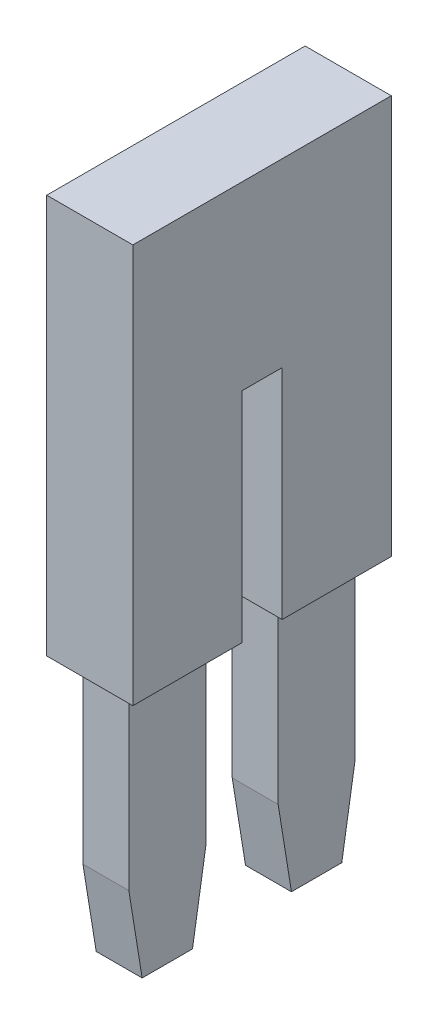
ISO-10303-21;
HEADER;
FILE_DESCRIPTION(('STEP AP214'),'2;1');
FILE_NAME('part.step','',(''),(''),'','','');
FILE_SCHEMA(('AUTOMOTIVE_DESIGN { 1 0 10303 214 1 1 1 1 }'));
ENDSEC;
DATA;
#1=APPLICATION_CONTEXT('core data for automotive mechanical design processes');
#2=APPLICATION_PROTOCOL_DEFINITION('international standard','automotive_design',2000,#1);
#3=PRODUCT_CONTEXT('',#1,'mechanical');
#4=PRODUCT('Part','Part','',(#3));
#5=PRODUCT_RELATED_PRODUCT_CATEGORY('part','',(#4));
#6=PRODUCT_DEFINITION_FORMATION('','',#4);
#7=PRODUCT_DEFINITION_CONTEXT('part definition',#1,'design');
#8=PRODUCT_DEFINITION('design','',#6,#7);
#9=PRODUCT_DEFINITION_SHAPE('','',#8);
#10=(LENGTH_UNIT() NAMED_UNIT(*) SI_UNIT(.MILLI.,.METRE.));
#11=(NAMED_UNIT(*) PLANE_ANGLE_UNIT() SI_UNIT($,.RADIAN.));
#12=(NAMED_UNIT(*) SI_UNIT($,.STERADIAN.) SOLID_ANGLE_UNIT());
#13=UNCERTAINTY_MEASURE_WITH_UNIT(LENGTH_MEASURE(1.E-05),#10,'distance_accuracy_value','');
#14=(GEOMETRIC_REPRESENTATION_CONTEXT(3) GLOBAL_UNCERTAINTY_ASSIGNED_CONTEXT((#13)) GLOBAL_UNIT_ASSIGNED_CONTEXT((#10,
#11,#12)) REPRESENTATION_CONTEXT('',''));
#15=CARTESIAN_POINT('',(0.,0.,0.));
#16=DIRECTION('',(0.,0.,1.));
#17=DIRECTION('',(1.,0.,0.));
#18=AXIS2_PLACEMENT_3D('',#15,#16,#17);
#19=CARTESIAN_POINT('',(3.47716482169647,-29.3736606406305,57.7849999999985));
#20=DIRECTION('',(0.,0.159368423411923,-0.987219178105449));
#21=DIRECTION('',(0.,0.987219178105449,0.159368423411923));
#22=AXIS2_PLACEMENT_3D('',#19,#20,#21);
#23=PLANE('',#22);
#24=DIRECTION('',(0.,-0.987219178105452,-0.159368423411904));
#25=VECTOR('',#24,1.);
#26=CARTESIAN_POINT('',(3.30716722169511,-29.2807420601841,57.7999999999983));
#27=LINE('',#26,#25);
#28=CARTESIAN_POINT('',(3.30716722169511,-29.2807420601841,57.7999999999983));
#29=VERTEX_POINT('',#28);
#30=CARTESIAN_POINT('',(3.30716722169511,-32.1500000022973,57.3368109486326));
#31=VERTEX_POINT('',#30);
#32=EDGE_CURVE('E154',#29,#31,#27,.T.);
#33=ORIENTED_EDGE('',*,*,#32,.T.);
#34=DIRECTION('',(1.,1.2612133559742E-13,0.));
#35=VECTOR('',#34,1.);
#36=CARTESIAN_POINT('',(3.30716722167853,-32.1500000022974,57.3368109486326));
#37=LINE('',#36,#35);
#38=CARTESIAN_POINT('',(4.90716722169511,-32.1500000022973,57.3368109486326));
#39=VERTEX_POINT('',#38);
#40=EDGE_CURVE('E156',#39,#31,#37,.F.);
#41=ORIENTED_EDGE('',*,*,#40,.F.);
#42=DIRECTION('',(0.,0.987219178105452,0.159368423411905));
#43=VECTOR('',#42,1.);
#44=CARTESIAN_POINT('',(4.90716722169511,-32.1500000022972,57.3368109486326));
#45=LINE('',#44,#43);
#46=CARTESIAN_POINT('',(4.90716722169511,-29.280742060184,57.7999999999983));
#47=VERTEX_POINT('',#46);
#48=EDGE_CURVE('E216',#39,#47,#45,.T.);
#49=ORIENTED_EDGE('',*,*,#48,.T.);
#50=DIRECTION('',(1.,0.,0.));
#51=VECTOR('',#50,1.);
#52=CARTESIAN_POINT('',(5.03716962172036,-29.2807420601839,57.7999999999983));
#53=LINE('',#52,#51);
#54=EDGE_CURVE('E151',#47,#29,#53,.F.);
#55=ORIENTED_EDGE('',*,*,#54,.T.);
#56=EDGE_LOOP('',(#33,#41,#49,#55));
#57=FACE_BOUND('',#56,.T.);
#58=ADVANCED_FACE('F16',(#57),#23,.F.);
#59=CARTESIAN_POINT('',(5.03716962172036,-33.0498680000002,57.7999999999983));
#60=DIRECTION('',(0.,0.,-1.));
#61=DIRECTION('',(0.,1.,0.));
#62=AXIS2_PLACEMENT_3D('',#59,#60,#61);
#63=PLANE('',#62);
#64=DIRECTION('',(0.,1.,0.));
#65=VECTOR('',#64,1.);
#66=CARTESIAN_POINT('',(4.90716722169511,-28.2741770422348,57.7999999999983));
#67=LINE('',#66,#65);
#68=CARTESIAN_POINT('',(4.90716722169511,-23.0750000000002,57.7999999999983));
#69=VERTEX_POINT('',#68);
#70=EDGE_CURVE('E212',#47,#69,#67,.T.);
#71=ORIENTED_EDGE('',*,*,#70,.T.);
#72=DIRECTION('',(1.,0.,0.));
#73=VECTOR('',#72,1.);
#74=CARTESIAN_POINT('',(5.03716962172036,-23.0750000000003,57.7999999999983));
#75=LINE('',#74,#73);
#76=CARTESIAN_POINT('',(3.30716722169511,-23.0750000000003,57.7999999999983));
#77=VERTEX_POINT('',#76);
#78=EDGE_CURVE('E19',#77,#69,#75,.T.);
#79=ORIENTED_EDGE('',*,*,#78,.F.);
#80=DIRECTION('',(0.,1.,0.));
#81=VECTOR('',#80,1.);
#82=CARTESIAN_POINT('',(3.30716722169511,-28.2741770422348,57.7999999999983));
#83=LINE('',#82,#81);
#84=EDGE_CURVE('E274',#77,#29,#83,.F.);
#85=ORIENTED_EDGE('',*,*,#84,.T.);
#86=ORIENTED_EDGE('',*,*,#54,.F.);
#87=EDGE_LOOP('',(#71,#79,#85,#86));
#88=FACE_BOUND('',#87,.T.);
#89=ADVANCED_FACE('F213',(#88),#63,.F.);
#90=CARTESIAN_POINT('',(4.90716722169699,-17.9749999999731,55.1199999999994));
#91=DIRECTION('',(0.,0.,-1.));
#92=DIRECTION('',(0.,1.,0.));
#93=AXIS2_PLACEMENT_3D('',#90,#91,#92);
#94=PLANE('',#93);
#95=DIRECTION('',(1.,0.,0.));
#96=VECTOR('',#95,1.);
#97=CARTESIAN_POINT('',(4.90716722169699,-23.0750000000003,55.1199999999994));
#98=LINE('',#97,#96);
#99=CARTESIAN_POINT('',(3.30716722169511,-23.0750000000003,55.1199999999994));
#100=VERTEX_POINT('',#99);
#101=CARTESIAN_POINT('',(4.90716722169511,-23.0750000000002,55.1199999999994));
#102=VERTEX_POINT('',#101);
#103=EDGE_CURVE('E201',#100,#102,#98,.T.);
#104=ORIENTED_EDGE('',*,*,#103,.T.);
#105=DIRECTION('',(0.,1.,0.));
#106=VECTOR('',#105,1.);
#107=CARTESIAN_POINT('',(4.90716722169511,-28.2741770422348,55.1199999999994));
#108=LINE('',#107,#106);
#109=CARTESIAN_POINT('',(4.90716722169511,-29.2807420565084,55.1199999999994));
#110=VERTEX_POINT('',#109);
#111=EDGE_CURVE('E215',#102,#110,#108,.F.);
#112=ORIENTED_EDGE('',*,*,#111,.T.);
#113=DIRECTION('',(1.,0.,0.));
#114=VECTOR('',#113,1.);
#115=CARTESIAN_POINT('',(4.73716962167939,-29.2807420565084,55.1199999999994));
#116=LINE('',#115,#114);
#117=CARTESIAN_POINT('',(3.30716722169511,-29.2807420565085,55.1199999999994));
#118=VERTEX_POINT('',#117);
#119=EDGE_CURVE('E199',#110,#118,#116,.F.);
#120=ORIENTED_EDGE('',*,*,#119,.T.);
#121=DIRECTION('',(0.,1.,0.));
#122=VECTOR('',#121,1.);
#123=CARTESIAN_POINT('',(3.30716722169511,-28.2741770422348,55.1199999999994));
#124=LINE('',#123,#122);
#125=EDGE_CURVE('E181',#118,#100,#124,.T.);
#126=ORIENTED_EDGE('',*,*,#125,.T.);
#127=EDGE_LOOP('',(#104,#112,#120,#126));
#128=FACE_BOUND('',#127,.T.);
#129=ADVANCED_FACE('F277',(#128),#94,.T.);
#130=CARTESIAN_POINT('',(4.73716962167939,-29.3736606429223,55.1350000009626));
#131=DIRECTION('',(0.,0.159368423411924,0.987219178105449));
#132=DIRECTION('',(0.,-0.987219178105449,0.159368423411924));
#133=AXIS2_PLACEMENT_3D('',#130,#131,#132);
#134=PLANE('',#133);
#135=DIRECTION('',(0.,-0.987219178105451,0.15936842341191));
#136=VECTOR('',#135,1.);
#137=CARTESIAN_POINT('',(4.90716722169511,-29.2807420565084,55.1199999999994));
#138=LINE('',#137,#136);
#139=CARTESIAN_POINT('',(4.90716722169511,-32.1500000022976,55.5831890519586));
#140=VERTEX_POINT('',#139);
#141=EDGE_CURVE('E270',#110,#140,#138,.T.);
#142=ORIENTED_EDGE('',*,*,#141,.T.);
#143=DIRECTION('',(1.,1.2612133559742E-13,0.));
#144=VECTOR('',#143,1.);
#145=CARTESIAN_POINT('',(3.30716722167853,-32.1500000022977,55.5831890519585));
#146=LINE('',#145,#144);
#147=CARTESIAN_POINT('',(3.30716722169511,-32.1500000022976,55.5831890519585));
#148=VERTEX_POINT('',#147);
#149=EDGE_CURVE('E173',#148,#140,#146,.T.);
#150=ORIENTED_EDGE('',*,*,#149,.F.);
#151=DIRECTION('',(0.,0.98721917810545,-0.159368423411916));
#152=VECTOR('',#151,1.);
#153=CARTESIAN_POINT('',(3.30716722169511,-32.1500000022977,55.5831890519585));
#154=LINE('',#153,#152);
#155=EDGE_CURVE('E179',#148,#118,#154,.T.);
#156=ORIENTED_EDGE('',*,*,#155,.T.);
#157=ORIENTED_EDGE('',*,*,#119,.F.);
#158=EDGE_LOOP('',(#142,#150,#156,#157));
#159=FACE_BOUND('',#158,.T.);
#160=ADVANCED_FACE('F280',(#159),#134,.F.);
#161=CARTESIAN_POINT('',(3.30716722167853,-32.1500000022975,56.8200000009626));
#162=DIRECTION('',(1.2612133559742E-13,-1.,1.44960956186225E-13));
#163=DIRECTION('',(0.,-1.44960956186225E-13,-1.));
#164=AXIS2_PLACEMENT_3D('',#161,#162,#163);
#165=PLANE('',#164);
#166=DIRECTION('',(0.,0.,1.));
#167=VECTOR('',#166,1.);
#168=CARTESIAN_POINT('',(4.90716722169511,-32.1500000022975,50.1969815864435));
#169=LINE('',#168,#167);
#170=EDGE_CURVE('E170',#140,#39,#169,.T.);
#171=ORIENTED_EDGE('',*,*,#170,.T.);
#172=ORIENTED_EDGE('',*,*,#40,.T.);
#173=DIRECTION('',(0.,0.,-1.));
#174=VECTOR('',#173,1.);
#175=CARTESIAN_POINT('',(3.30716722169511,-32.1500000022974,62.7230184135552));
#176=LINE('',#175,#174);
#177=EDGE_CURVE('E161',#31,#148,#176,.T.);
#178=ORIENTED_EDGE('',*,*,#177,.T.);
#179=ORIENTED_EDGE('',*,*,#149,.T.);
#180=EDGE_LOOP('',(#171,#172,#178,#179));
#181=FACE_BOUND('',#180,.T.);
#182=ADVANCED_FACE('F166',(#181),#165,.T.);
#183=CARTESIAN_POINT('',(4.90716722169701,-23.974999318645,49.9199999999994));
#184=DIRECTION('',(0.,-1.45401068734245E-13,-1.));
#185=DIRECTION('',(0.,1.,-1.45401068734245E-13));
#186=AXIS2_PLACEMENT_3D('',#183,#184,#185);
#187=PLANE('',#186);
#188=DIRECTION('',(1.,0.,0.));
#189=VECTOR('',#188,1.);
#190=CARTESIAN_POINT('',(4.73716962167939,-29.2807420565127,49.9200000000003));
#191=LINE('',#190,#189);
#192=CARTESIAN_POINT('',(4.90716722169511,-29.2807420565113,49.92));
#193=VERTEX_POINT('',#192);
#194=CARTESIAN_POINT('',(3.30716722169511,-29.2807420565114,49.92));
#195=VERTEX_POINT('',#194);
#196=EDGE_CURVE('E195',#193,#195,#191,.F.);
#197=ORIENTED_EDGE('',*,*,#196,.T.);
#198=DIRECTION('',(0.,1.,0.));
#199=VECTOR('',#198,1.);
#200=CARTESIAN_POINT('',(3.30716722169511,-28.2741770422348,49.9199999999993));
#201=LINE('',#200,#199);
#202=CARTESIAN_POINT('',(3.30716722169511,-23.0750000000003,49.9199999999993));
#203=VERTEX_POINT('',#202);
#204=EDGE_CURVE('E266',#203,#195,#201,.F.);
#205=ORIENTED_EDGE('',*,*,#204,.F.);
#206=DIRECTION('',(1.,0.,0.));
#207=VECTOR('',#206,1.);
#208=CARTESIAN_POINT('',(4.90716722169701,-23.0750000000003,49.9199999999993));
#209=LINE('',#208,#207);
#210=CARTESIAN_POINT('',(4.90716722169511,-23.0750000000002,49.9199999999993));
#211=VERTEX_POINT('',#210);
#212=EDGE_CURVE('E172',#203,#211,#209,.T.);
#213=ORIENTED_EDGE('',*,*,#212,.T.);
#214=DIRECTION('',(0.,1.,0.));
#215=VECTOR('',#214,1.);
#216=CARTESIAN_POINT('',(4.90716722169511,-28.2741770422348,49.9199999999993));
#217=LINE('',#216,#215);
#218=EDGE_CURVE('E252',#211,#193,#217,.F.);
#219=ORIENTED_EDGE('',*,*,#218,.T.);
#220=EDGE_LOOP('',(#197,#205,#213,#219));
#221=FACE_BOUND('',#220,.T.);
#222=ADVANCED_FACE('F288',(#221),#187,.T.);
#223=CARTESIAN_POINT('',(4.73716962167939,-29.3736606429215,49.9350000009626));
#224=DIRECTION('',(0.,0.159368423411924,0.987219178105449));
#225=DIRECTION('',(0.,-0.987219178105449,0.159368423411924));
#226=AXIS2_PLACEMENT_3D('',#223,#224,#225);
#227=PLANE('',#226);
#228=DIRECTION('',(0.,-0.98721917810545,0.159368423411919));
#229=VECTOR('',#228,1.);
#230=CARTESIAN_POINT('',(3.30716722169511,-29.2807420565129,49.9200000000002));
#231=LINE('',#230,#229);
#232=CARTESIAN_POINT('',(3.30716722169511,-32.1500000022969,50.3831890519585));
#233=VERTEX_POINT('',#232);
#234=EDGE_CURVE('E263',#195,#233,#231,.T.);
#235=ORIENTED_EDGE('',*,*,#234,.F.);
#236=ORIENTED_EDGE('',*,*,#196,.F.);
#237=DIRECTION('',(0.,-0.98721917810545,0.159368423411919));
#238=VECTOR('',#237,1.);
#239=CARTESIAN_POINT('',(4.90716722169511,-29.2807420565127,49.9200000000002));
#240=LINE('',#239,#238);
#241=CARTESIAN_POINT('',(4.90716722169511,-32.1500000022968,50.3831890519586));
#242=VERTEX_POINT('',#241);
#243=EDGE_CURVE('E250',#193,#242,#240,.T.);
#244=ORIENTED_EDGE('',*,*,#243,.T.);
#245=DIRECTION('',(1.,1.2612133559742E-13,0.));
#246=VECTOR('',#245,1.);
#247=CARTESIAN_POINT('',(3.30716722167853,-32.1500000022969,50.3831890519585));
#248=LINE('',#247,#246);
#249=EDGE_CURVE('E192',#233,#242,#248,.T.);
#250=ORIENTED_EDGE('',*,*,#249,.F.);
#251=EDGE_LOOP('',(#235,#236,#244,#250));
#252=FACE_BOUND('',#251,.T.);
#253=ADVANCED_FACE('F356',(#252),#227,.F.);
#254=CARTESIAN_POINT('',(3.30716722167853,-32.1500000022967,51.6200000009626));
#255=DIRECTION('',(1.2612133559742E-13,-1.,1.44960956186225E-13));
#256=DIRECTION('',(0.,-1.44960956186225E-13,-1.));
#257=AXIS2_PLACEMENT_3D('',#254,#255,#256);
#258=PLANE('',#257);
#259=DIRECTION('',(0.,0.,1.));
#260=VECTOR('',#259,1.);
#261=CARTESIAN_POINT('',(3.30716722169511,-32.1500000022969,50.1969815864435));
#262=LINE('',#261,#260);
#263=CARTESIAN_POINT('',(3.30716722169511,-32.1500000022967,52.1368109486328));
#264=VERTEX_POINT('',#263);
#265=EDGE_CURVE('E260',#233,#264,#262,.T.);
#266=ORIENTED_EDGE('',*,*,#265,.F.);
#267=ORIENTED_EDGE('',*,*,#249,.T.);
#268=DIRECTION('',(0.,0.,1.));
#269=VECTOR('',#268,1.);
#270=CARTESIAN_POINT('',(4.90716722169511,-32.1500000022967,50.1969815864435));
#271=LINE('',#270,#269);
#272=CARTESIAN_POINT('',(4.90716722169511,-32.1500000022965,52.1368109486328));
#273=VERTEX_POINT('',#272);
#274=EDGE_CURVE('E248',#242,#273,#271,.T.);
#275=ORIENTED_EDGE('',*,*,#274,.T.);
#276=DIRECTION('',(1.,0.,0.));
#277=VECTOR('',#276,1.);
#278=CARTESIAN_POINT('',(3.47716482169647,-32.1500000022964,52.1368109486329));
#279=LINE('',#278,#277);
#280=EDGE_CURVE('E190',#273,#264,#279,.F.);
#281=ORIENTED_EDGE('',*,*,#280,.T.);
#282=EDGE_LOOP('',(#266,#267,#275,#281));
#283=FACE_BOUND('',#282,.T.);
#284=ADVANCED_FACE('F352',(#283),#258,.T.);
#285=CARTESIAN_POINT('',(3.47716482169647,-29.3736606406312,52.5849999999985));
#286=DIRECTION('',(0.,0.159368423411923,-0.987219178105449));
#287=DIRECTION('',(0.,0.987219178105449,0.159368423411923));
#288=AXIS2_PLACEMENT_3D('',#285,#286,#287);
#289=PLANE('',#288);
#290=DIRECTION('',(1.,0.,0.));
#291=VECTOR('',#290,1.);
#292=CARTESIAN_POINT('',(5.0371696217196,-29.2807420601847,52.5999999999983));
#293=LINE('',#292,#291);
#294=CARTESIAN_POINT('',(4.90716722169511,-29.2807420601848,52.5999999999983));
#295=VERTEX_POINT('',#294);
#296=CARTESIAN_POINT('',(3.30716722169511,-29.2807420601848,52.5999999999983));
#297=VERTEX_POINT('',#296);
#298=EDGE_CURVE('E186',#295,#297,#293,.F.);
#299=ORIENTED_EDGE('',*,*,#298,.T.);
#300=DIRECTION('',(0.,0.987219178105449,0.159368423411921));
#301=VECTOR('',#300,1.);
#302=CARTESIAN_POINT('',(3.30716722169511,-32.1500000022966,52.1368109486328));
#303=LINE('',#302,#301);
#304=EDGE_CURVE('E257',#264,#297,#303,.T.);
#305=ORIENTED_EDGE('',*,*,#304,.F.);
#306=ORIENTED_EDGE('',*,*,#280,.F.);
#307=DIRECTION('',(0.,0.987219178105448,0.159368423411926));
#308=VECTOR('',#307,1.);
#309=CARTESIAN_POINT('',(4.90716722169511,-32.1500000022964,52.1368109486328));
#310=LINE('',#309,#308);
#311=EDGE_CURVE('E246',#273,#295,#310,.T.);
#312=ORIENTED_EDGE('',*,*,#311,.T.);
#313=EDGE_LOOP('',(#299,#305,#306,#312));
#314=FACE_BOUND('',#313,.T.);
#315=ADVANCED_FACE('F348',(#314),#289,.F.);
#316=CARTESIAN_POINT('',(5.0371696217196,-33.0498679999995,52.5999999999983));
#317=DIRECTION('',(0.,0.,-1.));
#318=DIRECTION('',(0.,1.,0.));
#319=AXIS2_PLACEMENT_3D('',#316,#317,#318);
#320=PLANE('',#319);
#321=DIRECTION('',(0.,1.,0.));
#322=VECTOR('',#321,1.);
#323=CARTESIAN_POINT('',(4.90716722169511,-28.2741770422348,52.5999999999983));
#324=LINE('',#323,#322);
#325=CARTESIAN_POINT('',(4.90716722169511,-23.0750000000002,52.5999999999983));
#326=VERTEX_POINT('',#325);
#327=EDGE_CURVE('E243',#295,#326,#324,.T.);
#328=ORIENTED_EDGE('',*,*,#327,.T.);
#329=DIRECTION('',(1.,0.,0.));
#330=VECTOR('',#329,1.);
#331=CARTESIAN_POINT('',(5.0371696217196,-23.0750000000003,52.5999999999983));
#332=LINE('',#331,#330);
#333=CARTESIAN_POINT('',(3.30716722169511,-23.0750000000003,52.5999999999983));
#334=VERTEX_POINT('',#333);
#335=EDGE_CURVE('E188',#334,#326,#332,.T.);
#336=ORIENTED_EDGE('',*,*,#335,.F.);
#337=DIRECTION('',(0.,1.,0.));
#338=VECTOR('',#337,1.);
#339=CARTESIAN_POINT('',(3.30716722169511,-28.2741770422348,52.5999999999983));
#340=LINE('',#339,#338);
#341=EDGE_CURVE('E254',#297,#334,#340,.T.);
#342=ORIENTED_EDGE('',*,*,#341,.F.);
#343=ORIENTED_EDGE('',*,*,#298,.F.);
#344=EDGE_LOOP('',(#328,#336,#342,#343));
#345=FACE_BOUND('',#344,.T.);
#346=ADVANCED_FACE('F344',(#345),#320,.F.);
#347=CARTESIAN_POINT('',(5.00030634413047,-15.4750000000001,52.5339438048216));
#348=DIRECTION('',(1.26121335597418E-13,-1.,0.));
#349=DIRECTION('',(1.,1.26121335597418E-13,0.));
#350=AXIS2_PLACEMENT_3D('',#347,#348,#349);
#351=PLANE('',#350);
#352=DIRECTION('',(1.,0.,0.));
#353=VECTOR('',#352,1.);
#354=CARTESIAN_POINT('',(6.22329031070278,-15.475,54.5599999999988));
#355=LINE('',#354,#353);
#356=CARTESIAN_POINT('',(5.60716722168537,-15.475,54.5599999999988));
#357=VERTEX_POINT('',#356);
#358=CARTESIAN_POINT('',(2.60716722168537,-15.4750000000003,54.5599999999988));
#359=VERTEX_POINT('',#358);
#360=EDGE_CURVE('E226',#357,#359,#355,.F.);
#361=ORIENTED_EDGE('',*,*,#360,.T.);
#362=DIRECTION('',(0.,0.,1.));
#363=VECTOR('',#362,1.);
#364=CARTESIAN_POINT('',(2.60716722168537,-15.4750000000004,52.5339438048216));
#365=LINE('',#364,#363);
#366=CARTESIAN_POINT('',(2.60716722168537,-15.4750000000003,53.1599999999988));
#367=VERTEX_POINT('',#366);
#368=EDGE_CURVE('E162',#359,#367,#365,.F.);
#369=ORIENTED_EDGE('',*,*,#368,.T.);
#370=DIRECTION('',(1.,0.,0.));
#371=VECTOR('',#370,1.);
#372=CARTESIAN_POINT('',(5.60716722168537,-15.475,53.1599999999988));
#373=LINE('',#372,#371);
#374=CARTESIAN_POINT('',(5.60716722168537,-15.475,53.1599999999988));
#375=VERTEX_POINT('',#374);
#376=EDGE_CURVE('E235',#375,#367,#373,.F.);
#377=ORIENTED_EDGE('',*,*,#376,.F.);
#378=DIRECTION('',(0.,0.,-1.));
#379=VECTOR('',#378,1.);
#380=CARTESIAN_POINT('',(5.60716722168537,-15.475,56.839589));
#381=LINE('',#380,#379);
#382=EDGE_CURVE('E241',#357,#375,#381,.T.);
#383=ORIENTED_EDGE('',*,*,#382,.F.);
#384=EDGE_LOOP('',(#361,#369,#377,#383));
#385=FACE_BOUND('',#384,.T.);
#386=ADVANCED_FACE('F341',(#385),#351,.T.);
#387=CARTESIAN_POINT('',(3.30716722169511,-28.2741770422348,62.7230184135552));
#388=DIRECTION('',(1.,0.,0.));
#389=DIRECTION('',(0.,0.,-1.));
#390=AXIS2_PLACEMENT_3D('',#387,#388,#389);
#391=PLANE('',#390);
#392=DIRECTION('',(0.,0.,1.));
#393=VECTOR('',#392,1.);
#394=CARTESIAN_POINT('',(3.30716722169511,-23.0750000000003,57.7100000000004));
#395=LINE('',#394,#393);
#396=EDGE_CURVE('E209',#100,#77,#395,.T.);
#397=ORIENTED_EDGE('',*,*,#396,.F.);
#398=ORIENTED_EDGE('',*,*,#125,.F.);
#399=ORIENTED_EDGE('',*,*,#155,.F.);
#400=ORIENTED_EDGE('',*,*,#177,.F.);
#401=ORIENTED_EDGE('',*,*,#32,.F.);
#402=ORIENTED_EDGE('',*,*,#84,.F.);
#403=EDGE_LOOP('',(#397,#398,#399,#400,#401,#402));
#404=FACE_BOUND('',#403,.T.);
#405=ADVANCED_FACE('F176',(#404),#391,.F.);
#406=CARTESIAN_POINT('',(4.90716722169511,-28.2741770422348,50.1969815864435));
#407=DIRECTION('',(-1.,0.,0.));
#408=DIRECTION('',(0.,0.,1.));
#409=AXIS2_PLACEMENT_3D('',#406,#407,#408);
#410=PLANE('',#409);
#411=ORIENTED_EDGE('',*,*,#141,.F.);
#412=ORIENTED_EDGE('',*,*,#111,.F.);
#413=DIRECTION('',(0.,0.,1.));
#414=VECTOR('',#413,1.);
#415=CARTESIAN_POINT('',(4.90716722169511,-23.0750000000001,57.7100000000004));
#416=LINE('',#415,#414);
#417=EDGE_CURVE('E208',#69,#102,#416,.F.);
#418=ORIENTED_EDGE('',*,*,#417,.F.);
#419=ORIENTED_EDGE('',*,*,#70,.F.);
#420=ORIENTED_EDGE('',*,*,#48,.F.);
#421=ORIENTED_EDGE('',*,*,#170,.F.);
#422=EDGE_LOOP('',(#411,#412,#418,#419,#420,#421));
#423=FACE_BOUND('',#422,.T.);
#424=ADVANCED_FACE('F220',(#423),#410,.F.);
#425=CARTESIAN_POINT('',(3.30716722169511,-28.2741770422348,50.1969815864435));
#426=DIRECTION('',(-1.,0.,0.));
#427=DIRECTION('',(0.,0.,1.));
#428=AXIS2_PLACEMENT_3D('',#425,#426,#427);
#429=PLANE('',#428);
#430=ORIENTED_EDGE('',*,*,#341,.T.);
#431=DIRECTION('',(0.,0.,1.));
#432=VECTOR('',#431,1.);
#433=CARTESIAN_POINT('',(3.30716722169511,-23.0750000000003,57.7100000000004));
#434=LINE('',#433,#432);
#435=EDGE_CURVE('E373',#203,#334,#434,.T.);
#436=ORIENTED_EDGE('',*,*,#435,.F.);
#437=ORIENTED_EDGE('',*,*,#204,.T.);
#438=ORIENTED_EDGE('',*,*,#234,.T.);
#439=ORIENTED_EDGE('',*,*,#265,.T.);
#440=ORIENTED_EDGE('',*,*,#304,.T.);
#441=EDGE_LOOP('',(#430,#436,#437,#438,#439,#440));
#442=FACE_BOUND('',#441,.T.);
#443=ADVANCED_FACE('F332',(#442),#429,.T.);
#444=CARTESIAN_POINT('',(4.90716722169511,-28.2741770422348,50.1969815864435));
#445=DIRECTION('',(-1.,0.,0.));
#446=DIRECTION('',(0.,0.,1.));
#447=AXIS2_PLACEMENT_3D('',#444,#445,#446);
#448=PLANE('',#447);
#449=ORIENTED_EDGE('',*,*,#311,.F.);
#450=ORIENTED_EDGE('',*,*,#274,.F.);
#451=ORIENTED_EDGE('',*,*,#243,.F.);
#452=ORIENTED_EDGE('',*,*,#218,.F.);
#453=DIRECTION('',(0.,0.,1.));
#454=VECTOR('',#453,1.);
#455=CARTESIAN_POINT('',(4.90716722169511,-23.0750000000001,57.7100000000004));
#456=LINE('',#455,#454);
#457=EDGE_CURVE('E376',#326,#211,#456,.F.);
#458=ORIENTED_EDGE('',*,*,#457,.F.);
#459=ORIENTED_EDGE('',*,*,#327,.F.);
#460=EDGE_LOOP('',(#449,#450,#451,#452,#458,#459));
#461=FACE_BOUND('',#460,.T.);
#462=ADVANCED_FACE('F328',(#461),#448,.F.);
#463=CARTESIAN_POINT('',(5.60716722168537,-15.159115,56.839589));
#464=DIRECTION('',(1.,0.,0.));
#465=DIRECTION('',(0.,0.,-1.));
#466=AXIS2_PLACEMENT_3D('',#463,#464,#465);
#467=PLANE('',#466);
#468=DIRECTION('',(0.,1.,0.));
#469=VECTOR('',#468,1.);
#470=CARTESIAN_POINT('',(5.60716722168537,-7.891507,54.5599999999988));
#471=LINE('',#470,#469);
#472=CARTESIAN_POINT('',(5.60716722168537,-23.0750000000001,54.5599999999988));
#473=VERTEX_POINT('',#472);
#474=EDGE_CURVE('E232',#473,#357,#471,.T.);
#475=ORIENTED_EDGE('',*,*,#474,.T.);
#476=ORIENTED_EDGE('',*,*,#382,.T.);
#477=DIRECTION('',(0.,1.,0.));
#478=VECTOR('',#477,1.);
#479=CARTESIAN_POINT('',(5.60716722168537,-17.481736,53.1599999999988));
#480=LINE('',#479,#478);
#481=CARTESIAN_POINT('',(5.60716722168537,-23.0750000000001,53.1599999999988));
#482=VERTEX_POINT('',#481);
#483=EDGE_CURVE('E238',#482,#375,#480,.T.);
#484=ORIENTED_EDGE('',*,*,#483,.F.);
#485=DIRECTION('',(0.,0.,1.));
#486=VECTOR('',#485,1.);
#487=CARTESIAN_POINT('',(5.60716722168537,-23.075,57.7100000000004));
#488=LINE('',#487,#486);
#489=CARTESIAN_POINT('',(5.60716722168537,-23.075,49.3599999999988));
#490=VERTEX_POINT('',#489);
#491=EDGE_CURVE('E380',#490,#482,#488,.T.);
#492=ORIENTED_EDGE('',*,*,#491,.F.);
#493=DIRECTION('',(0.,1.,0.));
#494=VECTOR('',#493,1.);
#495=CARTESIAN_POINT('',(5.60716722168537,-9.1750000000004,49.3599999999988));
#496=LINE('',#495,#494);
#497=CARTESIAN_POINT('',(5.60716722168537,-9.1750000000004,49.3599999999988));
#498=VERTEX_POINT('',#497);
#499=EDGE_CURVE('E383',#498,#490,#496,.F.);
#500=ORIENTED_EDGE('',*,*,#499,.F.);
#501=DIRECTION('',(0.,0.,1.));
#502=VECTOR('',#501,1.);
#503=CARTESIAN_POINT('',(5.60716722168537,-9.1750000000004,28.8599999999988));
#504=LINE('',#503,#502);
#505=CARTESIAN_POINT('',(5.60716722168537,-9.1750000000004,58.3599999999988));
#506=VERTEX_POINT('',#505);
#507=EDGE_CURVE('E391',#506,#498,#504,.F.);
#508=ORIENTED_EDGE('',*,*,#507,.F.);
#509=DIRECTION('',(0.,1.,0.));
#510=VECTOR('',#509,1.);
#511=CARTESIAN_POINT('',(5.60716722168537,-17.481736,58.3599999999988));
#512=LINE('',#511,#510);
#513=CARTESIAN_POINT('',(5.60716722168537,-23.0750000000001,58.3599999999988));
#514=VERTEX_POINT('',#513);
#515=EDGE_CURVE('E397',#514,#506,#512,.T.);
#516=ORIENTED_EDGE('',*,*,#515,.F.);
#517=DIRECTION('',(0.,0.,1.));
#518=VECTOR('',#517,1.);
#519=CARTESIAN_POINT('',(5.60716722168537,-23.075,57.7100000000004));
#520=LINE('',#519,#518);
#521=EDGE_CURVE('E221',#473,#514,#520,.T.);
#522=ORIENTED_EDGE('',*,*,#521,.F.);
#523=EDGE_LOOP('',(#475,#476,#484,#492,#500,#508,#516,#522));
#524=FACE_BOUND('',#523,.T.);
#525=ADVANCED_FACE('F324',(#524),#467,.T.);
#526=CARTESIAN_POINT('',(5.60716722168537,-17.481736,53.1599999999988));
#527=DIRECTION('',(0.,0.,1.));
#528=DIRECTION('',(1.,0.,0.));
#529=AXIS2_PLACEMENT_3D('',#526,#527,#528);
#530=PLANE('',#529);
#531=DIRECTION('',(0.,1.,0.));
#532=VECTOR('',#531,1.);
#533=CARTESIAN_POINT('',(2.60716722168537,-13.452485,53.1599999999988));
#534=LINE('',#533,#532);
#535=CARTESIAN_POINT('',(2.60716722168537,-23.0750000000004,53.1599999999988));
#536=VERTEX_POINT('',#535);
#537=EDGE_CURVE('E421',#536,#367,#534,.T.);
#538=ORIENTED_EDGE('',*,*,#537,.F.);
#539=DIRECTION('',(1.,1.26121335597418E-13,0.));
#540=VECTOR('',#539,1.);
#541=CARTESIAN_POINT('',(4.90716722169687,-23.0750000000001,53.1599999999988));
#542=LINE('',#541,#540);
#543=EDGE_CURVE('E425',#482,#536,#542,.F.);
#544=ORIENTED_EDGE('',*,*,#543,.F.);
#545=ORIENTED_EDGE('',*,*,#483,.T.);
#546=ORIENTED_EDGE('',*,*,#376,.T.);
#547=EDGE_LOOP('',(#538,#544,#545,#546));
#548=FACE_BOUND('',#547,.T.);
#549=ADVANCED_FACE('F320',(#548),#530,.T.);
#550=CARTESIAN_POINT('',(6.22329031070278,-7.891507,54.5599999999988));
#551=DIRECTION('',(0.,0.,1.));
#552=DIRECTION('',(1.,0.,0.));
#553=AXIS2_PLACEMENT_3D('',#550,#551,#552);
#554=PLANE('',#553);
#555=ORIENTED_EDGE('',*,*,#474,.F.);
#556=DIRECTION('',(1.,1.26121335597418E-13,0.));
#557=VECTOR('',#556,1.);
#558=CARTESIAN_POINT('',(4.90716722169687,-23.0750000000001,54.5599999999988));
#559=LINE('',#558,#557);
#560=CARTESIAN_POINT('',(2.60716722168537,-23.0750000000004,54.5599999999988));
#561=VERTEX_POINT('',#560);
#562=EDGE_CURVE('E224',#561,#473,#559,.T.);
#563=ORIENTED_EDGE('',*,*,#562,.F.);
#564=DIRECTION('',(0.,1.,0.));
#565=VECTOR('',#564,1.);
#566=CARTESIAN_POINT('',(2.60716722168537,-13.452485,54.5599999999988));
#567=LINE('',#566,#565);
#568=EDGE_CURVE('E407',#359,#561,#567,.F.);
#569=ORIENTED_EDGE('',*,*,#568,.F.);
#570=ORIENTED_EDGE('',*,*,#360,.F.);
#571=EDGE_LOOP('',(#555,#563,#569,#570));
#572=FACE_BOUND('',#571,.T.);
#573=ADVANCED_FACE('F316',(#572),#554,.F.);
#574=CARTESIAN_POINT('',(4.90716722169687,-23.0750000000001,57.7100000000004));
#575=DIRECTION('',(1.26121335597418E-13,-1.,0.));
#576=DIRECTION('',(1.,1.26121335597418E-13,0.));
#577=AXIS2_PLACEMENT_3D('',#574,#575,#576);
#578=PLANE('',#577);
#579=DIRECTION('',(0.,0.,1.));
#580=VECTOR('',#579,1.);
#581=CARTESIAN_POINT('',(2.60716722168537,-23.0750000000004,53.935122));
#582=LINE('',#581,#580);
#583=CARTESIAN_POINT('',(2.60716722168537,-23.0750000000004,58.3599999999988));
#584=VERTEX_POINT('',#583);
#585=EDGE_CURVE('E402',#561,#584,#582,.T.);
#586=ORIENTED_EDGE('',*,*,#585,.F.);
#587=ORIENTED_EDGE('',*,*,#562,.T.);
#588=ORIENTED_EDGE('',*,*,#521,.T.);
#589=DIRECTION('',(1.,0.,0.));
#590=VECTOR('',#589,1.);
#591=CARTESIAN_POINT('',(5.60716722168537,-23.0750000000004,58.3599999999988));
#592=LINE('',#591,#590);
#593=EDGE_CURVE('E394',#584,#514,#592,.T.);
#594=ORIENTED_EDGE('',*,*,#593,.F.);
#595=EDGE_LOOP('',(#586,#587,#588,#594));
#596=FACE_BOUND('',#595,.T.);
#597=ORIENTED_EDGE('',*,*,#417,.T.);
#598=ORIENTED_EDGE('',*,*,#103,.F.);
#599=ORIENTED_EDGE('',*,*,#396,.T.);
#600=ORIENTED_EDGE('',*,*,#78,.T.);
#601=EDGE_LOOP('',(#597,#598,#599,#600));
#602=FACE_BOUND('',#601,.T.);
#603=ADVANCED_FACE('F206',(#596,#602),#578,.T.);
#604=CARTESIAN_POINT('',(5.60716722168537,-17.481736,58.3599999999988));
#605=DIRECTION('',(0.,0.,1.));
#606=DIRECTION('',(1.,0.,0.));
#607=AXIS2_PLACEMENT_3D('',#604,#605,#606);
#608=PLANE('',#607);
#609=DIRECTION('',(0.,1.,0.));
#610=VECTOR('',#609,1.);
#611=CARTESIAN_POINT('',(2.60716722168537,-13.452485,58.3599999999988));
#612=LINE('',#611,#610);
#613=CARTESIAN_POINT('',(2.60716722168537,-9.1750000000004,58.3599999999988));
#614=VERTEX_POINT('',#613);
#615=EDGE_CURVE('E414',#584,#614,#612,.T.);
#616=ORIENTED_EDGE('',*,*,#615,.F.);
#617=ORIENTED_EDGE('',*,*,#593,.T.);
#618=ORIENTED_EDGE('',*,*,#515,.T.);
#619=DIRECTION('',(1.,0.,0.));
#620=VECTOR('',#619,1.);
#621=CARTESIAN_POINT('',(2.60716722168536,-9.1750000000004,58.3599999999988));
#622=LINE('',#621,#620);
#623=EDGE_CURVE('E388',#614,#506,#622,.T.);
#624=ORIENTED_EDGE('',*,*,#623,.F.);
#625=EDGE_LOOP('',(#616,#617,#618,#624));
#626=FACE_BOUND('',#625,.T.);
#627=ADVANCED_FACE('F309',(#626),#608,.T.);
#628=CARTESIAN_POINT('',(2.60716722168536,-9.1750000000004,28.8599999999988));
#629=DIRECTION('',(0.,1.,0.));
#630=DIRECTION('',(0.,0.,1.));
#631=AXIS2_PLACEMENT_3D('',#628,#629,#630);
#632=PLANE('',#631);
#633=DIRECTION('',(0.,0.,1.));
#634=VECTOR('',#633,1.);
#635=CARTESIAN_POINT('',(2.60716722168537,-9.1750000000004,53.935122));
#636=LINE('',#635,#634);
#637=CARTESIAN_POINT('',(2.60716722168537,-9.1750000000004,49.3599999999988));
#638=VERTEX_POINT('',#637);
#639=EDGE_CURVE('E412',#614,#638,#636,.F.);
#640=ORIENTED_EDGE('',*,*,#639,.F.);
#641=ORIENTED_EDGE('',*,*,#623,.T.);
#642=ORIENTED_EDGE('',*,*,#507,.T.);
#643=DIRECTION('',(-1.,0.,0.));
#644=VECTOR('',#643,1.);
#645=CARTESIAN_POINT('',(2.60716722168536,-9.1750000000004,49.3599999999988));
#646=LINE('',#645,#644);
#647=EDGE_CURVE('E377',#638,#498,#646,.F.);
#648=ORIENTED_EDGE('',*,*,#647,.F.);
#649=EDGE_LOOP('',(#640,#641,#642,#648));
#650=FACE_BOUND('',#649,.T.);
#651=ADVANCED_FACE('F306',(#650),#632,.T.);
#652=CARTESIAN_POINT('',(2.60716722168536,-9.1750000000004,49.3599999999988));
#653=DIRECTION('',(0.,0.,-1.));
#654=DIRECTION('',(-1.,0.,0.));
#655=AXIS2_PLACEMENT_3D('',#652,#653,#654);
#656=PLANE('',#655);
#657=DIRECTION('',(0.,1.,0.));
#658=VECTOR('',#657,1.);
#659=CARTESIAN_POINT('',(2.60716722168537,-13.452485,49.3599999999988));
#660=LINE('',#659,#658);
#661=CARTESIAN_POINT('',(2.60716722168537,-23.0750000000002,49.3599999999988));
#662=VERTEX_POINT('',#661);
#663=EDGE_CURVE('E25',#638,#662,#660,.F.);
#664=ORIENTED_EDGE('',*,*,#663,.F.);
#665=ORIENTED_EDGE('',*,*,#647,.T.);
#666=ORIENTED_EDGE('',*,*,#499,.T.);
#667=DIRECTION('',(1.,1.26121335597418E-13,0.));
#668=VECTOR('',#667,1.);
#669=CARTESIAN_POINT('',(4.90716722169687,-23.0750000000001,49.3599999999988));
#670=LINE('',#669,#668);
#671=EDGE_CURVE('E34',#662,#490,#670,.T.);
#672=ORIENTED_EDGE('',*,*,#671,.F.);
#673=EDGE_LOOP('',(#664,#665,#666,#672));
#674=FACE_BOUND('',#673,.T.);
#675=ADVANCED_FACE('F299',(#674),#656,.T.);
#676=CARTESIAN_POINT('',(4.90716722169687,-23.0750000000001,57.7100000000004));
#677=DIRECTION('',(1.26121335597418E-13,-1.,0.));
#678=DIRECTION('',(1.,1.26121335597418E-13,0.));
#679=AXIS2_PLACEMENT_3D('',#676,#677,#678);
#680=PLANE('',#679);
#681=DIRECTION('',(0.,0.,1.));
#682=VECTOR('',#681,1.);
#683=CARTESIAN_POINT('',(2.60716722168537,-23.0750000000004,53.935122));
#684=LINE('',#683,#682);
#685=EDGE_CURVE('E11',#662,#536,#684,.T.);
#686=ORIENTED_EDGE('',*,*,#685,.F.);
#687=ORIENTED_EDGE('',*,*,#671,.T.);
#688=ORIENTED_EDGE('',*,*,#491,.T.);
#689=ORIENTED_EDGE('',*,*,#543,.T.);
#690=EDGE_LOOP('',(#686,#687,#688,#689));
#691=FACE_BOUND('',#690,.T.);
#692=ORIENTED_EDGE('',*,*,#335,.T.);
#693=ORIENTED_EDGE('',*,*,#457,.T.);
#694=ORIENTED_EDGE('',*,*,#212,.F.);
#695=ORIENTED_EDGE('',*,*,#435,.T.);
#696=EDGE_LOOP('',(#692,#693,#694,#695));
#697=FACE_BOUND('',#696,.T.);
#698=ADVANCED_FACE('F293',(#691,#697),#680,.T.);
#699=CARTESIAN_POINT('',(2.60716722168537,-13.452485,53.935122));
#700=DIRECTION('',(-1.,0.,0.));
#701=DIRECTION('',(0.,0.,1.));
#702=AXIS2_PLACEMENT_3D('',#699,#700,#701);
#703=PLANE('',#702);
#704=ORIENTED_EDGE('',*,*,#663,.T.);
#705=ORIENTED_EDGE('',*,*,#685,.T.);
#706=ORIENTED_EDGE('',*,*,#537,.T.);
#707=ORIENTED_EDGE('',*,*,#368,.F.);
#708=ORIENTED_EDGE('',*,*,#568,.T.);
#709=ORIENTED_EDGE('',*,*,#585,.T.);
#710=ORIENTED_EDGE('',*,*,#615,.T.);
#711=ORIENTED_EDGE('',*,*,#639,.T.);
#712=EDGE_LOOP('',(#704,#705,#706,#707,#708,#709,#710,#711));
#713=FACE_BOUND('',#712,.T.);
#714=ADVANCED_FACE('F291',(#713),#703,.T.);
#715=CLOSED_SHELL('',(#58,#89,#129,#160,#182,#222,#253,#284,#315,#346,#386,#405,#424,#443,#462,
#525,#549,#573,#603,#627,#651,#675,#698,#714));
#716=MANIFOLD_SOLID_BREP('B1',#715);
#717=ADVANCED_BREP_SHAPE_REPRESENTATION('',(#18,#716),#14);
#718=SHAPE_DEFINITION_REPRESENTATION(#9,#717);
ENDSEC;
END-ISO-10303-21;
